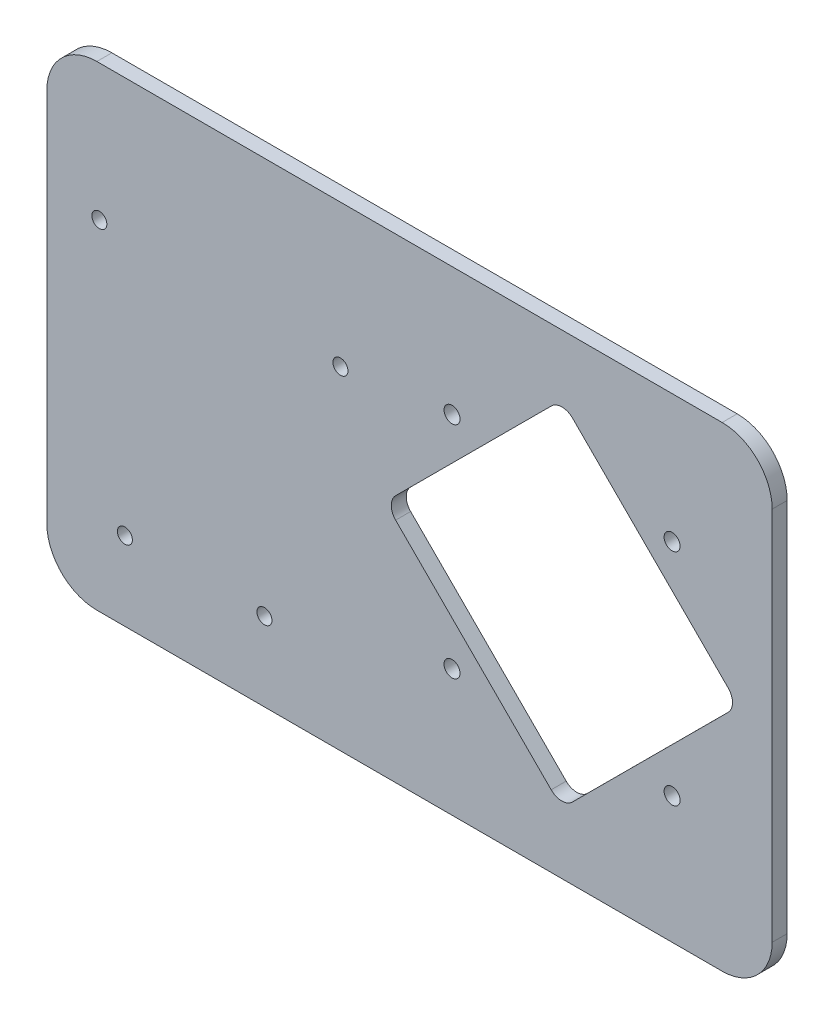
ISO-10303-21;
HEADER;
FILE_DESCRIPTION(('STEP AP214'),'2;1');
FILE_NAME('part.step','',(''),(''),'','','');
FILE_SCHEMA(('AUTOMOTIVE_DESIGN { 1 0 10303 214 1 1 1 1 }'));
ENDSEC;
DATA;
#1=APPLICATION_CONTEXT('core data for automotive mechanical design processes');
#2=APPLICATION_PROTOCOL_DEFINITION('international standard','automotive_design',2000,#1);
#3=PRODUCT_CONTEXT('',#1,'mechanical');
#4=PRODUCT('Part','Part','',(#3));
#5=PRODUCT_RELATED_PRODUCT_CATEGORY('part','',(#4));
#6=PRODUCT_DEFINITION_FORMATION('','',#4);
#7=PRODUCT_DEFINITION_CONTEXT('part definition',#1,'design');
#8=PRODUCT_DEFINITION('design','',#6,#7);
#9=PRODUCT_DEFINITION_SHAPE('','',#8);
#10=(LENGTH_UNIT() NAMED_UNIT(*) SI_UNIT(.MILLI.,.METRE.));
#11=(NAMED_UNIT(*) PLANE_ANGLE_UNIT() SI_UNIT($,.RADIAN.));
#12=(NAMED_UNIT(*) SI_UNIT($,.STERADIAN.) SOLID_ANGLE_UNIT());
#13=UNCERTAINTY_MEASURE_WITH_UNIT(LENGTH_MEASURE(1.E-05),#10,'distance_accuracy_value','');
#14=(GEOMETRIC_REPRESENTATION_CONTEXT(3) GLOBAL_UNCERTAINTY_ASSIGNED_CONTEXT((#13)) GLOBAL_UNIT_ASSIGNED_CONTEXT((#10,
#11,#12)) REPRESENTATION_CONTEXT('',''));
#15=CARTESIAN_POINT('',(0.,0.,0.));
#16=DIRECTION('',(0.,0.,1.));
#17=DIRECTION('',(1.,0.,0.));
#18=AXIS2_PLACEMENT_3D('',#15,#16,#17);
#19=CARTESIAN_POINT('',(269.068,12.31372,3.));
#20=DIRECTION('',(0.,0.,-1.));
#21=DIRECTION('',(-1.,0.,0.));
#22=AXIS2_PLACEMENT_3D('',#19,#20,#21);
#23=CYLINDRICAL_SURFACE('',#22,10.);
#24=CARTESIAN_POINT('',(269.068,12.31372,0.));
#25=DIRECTION('',(0.,0.,-1.));
#26=DIRECTION('',(-1.,0.,0.));
#27=AXIS2_PLACEMENT_3D('',#24,#25,#26);
#28=CIRCLE('',#27,10.);
#29=CARTESIAN_POINT('',(279.068,12.31372,0.));
#30=VERTEX_POINT('',#29);
#31=CARTESIAN_POINT('',(269.068,2.31372,0.));
#32=VERTEX_POINT('',#31);
#33=EDGE_CURVE('E278',#30,#32,#28,.T.);
#34=ORIENTED_EDGE('',*,*,#33,.F.);
#35=DIRECTION('',(0.,0.,-1.));
#36=VECTOR('',#35,1.);
#37=CARTESIAN_POINT('',(279.068,12.31372,3.));
#38=LINE('',#37,#36);
#39=CARTESIAN_POINT('',(279.068,12.31372,3.));
#40=VERTEX_POINT('',#39);
#41=EDGE_CURVE('E11',#40,#30,#38,.T.);
#42=ORIENTED_EDGE('',*,*,#41,.F.);
#43=CARTESIAN_POINT('',(269.068,12.31372,3.));
#44=DIRECTION('',(0.,0.,-1.));
#45=DIRECTION('',(-1.,0.,0.));
#46=AXIS2_PLACEMENT_3D('',#43,#44,#45);
#47=CIRCLE('',#46,10.);
#48=CARTESIAN_POINT('',(269.068,2.31372,3.));
#49=VERTEX_POINT('',#48);
#50=EDGE_CURVE('E282',#40,#49,#47,.T.);
#51=ORIENTED_EDGE('',*,*,#50,.T.);
#52=DIRECTION('',(0.,0.,-1.));
#53=VECTOR('',#52,1.);
#54=CARTESIAN_POINT('',(269.068,2.31372,3.));
#55=LINE('',#54,#53);
#56=EDGE_CURVE('E42',#49,#32,#55,.T.);
#57=ORIENTED_EDGE('',*,*,#56,.T.);
#58=EDGE_LOOP('',(#34,#42,#51,#57));
#59=FACE_BOUND('',#58,.T.);
#60=ADVANCED_FACE('F39',(#59),#23,.T.);
#61=CARTESIAN_POINT('',(279.068,87.313,3.));
#62=DIRECTION('',(1.,0.,0.));
#63=DIRECTION('',(0.,0.,-1.));
#64=AXIS2_PLACEMENT_3D('',#61,#62,#63);
#65=PLANE('',#64);
#66=DIRECTION('',(0.,-1.,0.));
#67=VECTOR('',#66,1.);
#68=CARTESIAN_POINT('',(279.068,87.313,0.));
#69=LINE('',#68,#67);
#70=CARTESIAN_POINT('',(279.068,87.313,0.));
#71=VERTEX_POINT('',#70);
#72=EDGE_CURVE('E287',#71,#30,#69,.T.);
#73=ORIENTED_EDGE('',*,*,#72,.F.);
#74=DIRECTION('',(0.,0.,-1.));
#75=VECTOR('',#74,1.);
#76=CARTESIAN_POINT('',(279.068,87.313,3.));
#77=LINE('',#76,#75);
#78=CARTESIAN_POINT('',(279.068,87.313,3.));
#79=VERTEX_POINT('',#78);
#80=EDGE_CURVE('E48',#79,#71,#77,.T.);
#81=ORIENTED_EDGE('',*,*,#80,.F.);
#82=DIRECTION('',(0.,-1.,0.));
#83=VECTOR('',#82,1.);
#84=CARTESIAN_POINT('',(279.068,87.313,3.));
#85=LINE('',#84,#83);
#86=EDGE_CURVE('E311',#79,#40,#85,.T.);
#87=ORIENTED_EDGE('',*,*,#86,.T.);
#88=ORIENTED_EDGE('',*,*,#41,.T.);
#89=EDGE_LOOP('',(#73,#81,#87,#88));
#90=FACE_BOUND('',#89,.T.);
#91=ADVANCED_FACE('F374',(#90),#65,.T.);
#92=CARTESIAN_POINT('',(269.068,87.313,3.));
#93=DIRECTION('',(0.,0.,-1.));
#94=DIRECTION('',(-1.,0.,0.));
#95=AXIS2_PLACEMENT_3D('',#92,#93,#94);
#96=CYLINDRICAL_SURFACE('',#95,10.);
#97=CARTESIAN_POINT('',(269.068,87.313,0.));
#98=DIRECTION('',(0.,0.,-1.));
#99=DIRECTION('',(-1.,0.,0.));
#100=AXIS2_PLACEMENT_3D('',#97,#98,#99);
#101=CIRCLE('',#100,10.);
#102=CARTESIAN_POINT('',(269.068,97.313,0.));
#103=VERTEX_POINT('',#102);
#104=EDGE_CURVE('E338',#103,#71,#101,.T.);
#105=ORIENTED_EDGE('',*,*,#104,.F.);
#106=DIRECTION('',(0.,0.,-1.));
#107=VECTOR('',#106,1.);
#108=CARTESIAN_POINT('',(269.068,97.313,3.));
#109=LINE('',#108,#107);
#110=CARTESIAN_POINT('',(269.068,97.313,3.));
#111=VERTEX_POINT('',#110);
#112=EDGE_CURVE('E347',#111,#103,#109,.T.);
#113=ORIENTED_EDGE('',*,*,#112,.F.);
#114=CARTESIAN_POINT('',(269.068,87.313,3.));
#115=DIRECTION('',(0.,0.,-1.));
#116=DIRECTION('',(-1.,0.,0.));
#117=AXIS2_PLACEMENT_3D('',#114,#115,#116);
#118=CIRCLE('',#117,10.);
#119=EDGE_CURVE('E307',#111,#79,#118,.T.);
#120=ORIENTED_EDGE('',*,*,#119,.T.);
#121=ORIENTED_EDGE('',*,*,#80,.T.);
#122=EDGE_LOOP('',(#105,#113,#120,#121));
#123=FACE_BOUND('',#122,.T.);
#124=ADVANCED_FACE('F394',(#123),#96,.T.);
#125=CARTESIAN_POINT('',(144.068,97.313,3.));
#126=DIRECTION('',(0.,1.,0.));
#127=DIRECTION('',(0.,0.,1.));
#128=AXIS2_PLACEMENT_3D('',#125,#126,#127);
#129=PLANE('',#128);
#130=DIRECTION('',(1.,0.,0.));
#131=VECTOR('',#130,1.);
#132=CARTESIAN_POINT('',(144.068,97.313,0.));
#133=LINE('',#132,#131);
#134=CARTESIAN_POINT('',(144.068,97.313,0.));
#135=VERTEX_POINT('',#134);
#136=EDGE_CURVE('E334',#135,#103,#133,.T.);
#137=ORIENTED_EDGE('',*,*,#136,.F.);
#138=DIRECTION('',(0.,0.,-1.));
#139=VECTOR('',#138,1.);
#140=CARTESIAN_POINT('',(144.068,97.313,3.));
#141=LINE('',#140,#139);
#142=CARTESIAN_POINT('',(144.068,97.313,3.));
#143=VERTEX_POINT('',#142);
#144=EDGE_CURVE('E350',#143,#135,#141,.T.);
#145=ORIENTED_EDGE('',*,*,#144,.F.);
#146=DIRECTION('',(1.,0.,0.));
#147=VECTOR('',#146,1.);
#148=CARTESIAN_POINT('',(144.068,97.313,3.));
#149=LINE('',#148,#147);
#150=EDGE_CURVE('E303',#143,#111,#149,.T.);
#151=ORIENTED_EDGE('',*,*,#150,.T.);
#152=ORIENTED_EDGE('',*,*,#112,.T.);
#153=EDGE_LOOP('',(#137,#145,#151,#152));
#154=FACE_BOUND('',#153,.T.);
#155=ADVANCED_FACE('F392',(#154),#129,.T.);
#156=CARTESIAN_POINT('',(144.068,87.313,3.));
#157=DIRECTION('',(0.,0.,-1.));
#158=DIRECTION('',(-1.,0.,0.));
#159=AXIS2_PLACEMENT_3D('',#156,#157,#158);
#160=CYLINDRICAL_SURFACE('',#159,9.99999999999995);
#161=CARTESIAN_POINT('',(144.068,87.313,0.));
#162=DIRECTION('',(0.,0.,-1.));
#163=DIRECTION('',(-1.,0.,0.));
#164=AXIS2_PLACEMENT_3D('',#161,#162,#163);
#165=CIRCLE('',#164,9.99999999999995);
#166=CARTESIAN_POINT('',(134.068,87.313,0.));
#167=VERTEX_POINT('',#166);
#168=EDGE_CURVE('E330',#167,#135,#165,.T.);
#169=ORIENTED_EDGE('',*,*,#168,.F.);
#170=DIRECTION('',(0.,0.,-1.));
#171=VECTOR('',#170,1.);
#172=CARTESIAN_POINT('',(134.068,87.313,3.));
#173=LINE('',#172,#171);
#174=CARTESIAN_POINT('',(134.068,87.313,3.));
#175=VERTEX_POINT('',#174);
#176=EDGE_CURVE('E353',#175,#167,#173,.T.);
#177=ORIENTED_EDGE('',*,*,#176,.F.);
#178=CARTESIAN_POINT('',(144.068,87.313,3.));
#179=DIRECTION('',(0.,0.,-1.));
#180=DIRECTION('',(-1.,0.,0.));
#181=AXIS2_PLACEMENT_3D('',#178,#179,#180);
#182=CIRCLE('',#181,9.99999999999995);
#183=EDGE_CURVE('E299',#175,#143,#182,.T.);
#184=ORIENTED_EDGE('',*,*,#183,.T.);
#185=ORIENTED_EDGE('',*,*,#144,.T.);
#186=EDGE_LOOP('',(#169,#177,#184,#185));
#187=FACE_BOUND('',#186,.T.);
#188=ADVANCED_FACE('F388',(#187),#160,.T.);
#189=CARTESIAN_POINT('',(134.068,12.31372,3.));
#190=DIRECTION('',(-1.,0.,0.));
#191=DIRECTION('',(0.,0.,1.));
#192=AXIS2_PLACEMENT_3D('',#189,#190,#191);
#193=PLANE('',#192);
#194=DIRECTION('',(0.,1.,0.));
#195=VECTOR('',#194,1.);
#196=CARTESIAN_POINT('',(134.068,12.31372,0.));
#197=LINE('',#196,#195);
#198=CARTESIAN_POINT('',(134.068,12.31372,0.));
#199=VERTEX_POINT('',#198);
#200=EDGE_CURVE('E326',#199,#167,#197,.T.);
#201=ORIENTED_EDGE('',*,*,#200,.F.);
#202=DIRECTION('',(0.,0.,-1.));
#203=VECTOR('',#202,1.);
#204=CARTESIAN_POINT('',(134.068,12.31372,3.));
#205=LINE('',#204,#203);
#206=CARTESIAN_POINT('',(134.068,12.31372,3.));
#207=VERTEX_POINT('',#206);
#208=EDGE_CURVE('E356',#207,#199,#205,.T.);
#209=ORIENTED_EDGE('',*,*,#208,.F.);
#210=DIRECTION('',(0.,1.,0.));
#211=VECTOR('',#210,1.);
#212=CARTESIAN_POINT('',(134.068,12.31372,3.));
#213=LINE('',#212,#211);
#214=EDGE_CURVE('E295',#207,#175,#213,.T.);
#215=ORIENTED_EDGE('',*,*,#214,.T.);
#216=ORIENTED_EDGE('',*,*,#176,.T.);
#217=EDGE_LOOP('',(#201,#209,#215,#216));
#218=FACE_BOUND('',#217,.T.);
#219=ADVANCED_FACE('F386',(#218),#193,.T.);
#220=CARTESIAN_POINT('',(144.068,12.31372,3.));
#221=DIRECTION('',(0.,0.,-1.));
#222=DIRECTION('',(-1.,0.,0.));
#223=AXIS2_PLACEMENT_3D('',#220,#221,#222);
#224=CYLINDRICAL_SURFACE('',#223,9.99999999999995);
#225=CARTESIAN_POINT('',(144.068,12.31372,0.));
#226=DIRECTION('',(0.,0.,-1.));
#227=DIRECTION('',(-1.,0.,0.));
#228=AXIS2_PLACEMENT_3D('',#225,#226,#227);
#229=CIRCLE('',#228,9.99999999999995);
#230=CARTESIAN_POINT('',(144.068,2.31372,0.));
#231=VERTEX_POINT('',#230);
#232=EDGE_CURVE('E322',#231,#199,#229,.T.);
#233=ORIENTED_EDGE('',*,*,#232,.F.);
#234=DIRECTION('',(0.,0.,-1.));
#235=VECTOR('',#234,1.);
#236=CARTESIAN_POINT('',(144.068,2.31372,3.));
#237=LINE('',#236,#235);
#238=CARTESIAN_POINT('',(144.068,2.31372,3.));
#239=VERTEX_POINT('',#238);
#240=EDGE_CURVE('E358',#239,#231,#237,.T.);
#241=ORIENTED_EDGE('',*,*,#240,.F.);
#242=CARTESIAN_POINT('',(144.068,12.31372,3.));
#243=DIRECTION('',(0.,0.,-1.));
#244=DIRECTION('',(-1.,0.,0.));
#245=AXIS2_PLACEMENT_3D('',#242,#243,#244);
#246=CIRCLE('',#245,9.99999999999995);
#247=EDGE_CURVE('E291',#239,#207,#246,.T.);
#248=ORIENTED_EDGE('',*,*,#247,.T.);
#249=ORIENTED_EDGE('',*,*,#208,.T.);
#250=EDGE_LOOP('',(#233,#241,#248,#249));
#251=FACE_BOUND('',#250,.T.);
#252=ADVANCED_FACE('F382',(#251),#224,.T.);
#253=CARTESIAN_POINT('',(269.068,2.31372,3.));
#254=DIRECTION('',(0.,-1.,0.));
#255=DIRECTION('',(0.,0.,-1.));
#256=AXIS2_PLACEMENT_3D('',#253,#254,#255);
#257=PLANE('',#256);
#258=DIRECTION('',(-1.,0.,0.));
#259=VECTOR('',#258,1.);
#260=CARTESIAN_POINT('',(269.068,2.31372,0.));
#261=LINE('',#260,#259);
#262=EDGE_CURVE('E318',#32,#231,#261,.T.);
#263=ORIENTED_EDGE('',*,*,#262,.F.);
#264=ORIENTED_EDGE('',*,*,#56,.F.);
#265=DIRECTION('',(-1.,0.,0.));
#266=VECTOR('',#265,1.);
#267=CARTESIAN_POINT('',(269.068,2.31372,3.));
#268=LINE('',#267,#266);
#269=EDGE_CURVE('E286',#49,#239,#268,.T.);
#270=ORIENTED_EDGE('',*,*,#269,.T.);
#271=ORIENTED_EDGE('',*,*,#240,.T.);
#272=EDGE_LOOP('',(#263,#264,#270,#271));
#273=FACE_BOUND('',#272,.T.);
#274=ADVANCED_FACE('F368',(#273),#257,.T.);
#275=CARTESIAN_POINT('',(269.068,12.31372,3.));
#276=DIRECTION('',(0.,0.,-1.));
#277=DIRECTION('',(-1.,0.,0.));
#278=AXIS2_PLACEMENT_3D('',#275,#276,#277);
#279=PLANE('',#278);
#280=CARTESIAN_POINT('',(259.067,27.688865329957,3.));
#281=DIRECTION('',(0.,0.,1.));
#282=DIRECTION('',(1.,0.,0.));
#283=AXIS2_PLACEMENT_3D('',#280,#281,#282);
#284=CIRCLE('',#283,1.59999999999996);
#285=CARTESIAN_POINT('',(260.667,27.688865329957,3.));
#286=VERTEX_POINT('',#285);
#287=EDGE_CURVE('E634',#286,#286,#284,.T.);
#288=ORIENTED_EDGE('',*,*,#287,.F.);
#289=EDGE_LOOP('',(#288));
#290=FACE_BOUND('',#289,.T.);
#291=CARTESIAN_POINT('',(215.068,27.688865329957,3.));
#292=DIRECTION('',(0.,0.,1.));
#293=DIRECTION('',(1.,0.,0.));
#294=AXIS2_PLACEMENT_3D('',#291,#292,#293);
#295=CIRCLE('',#294,1.59999999999999);
#296=CARTESIAN_POINT('',(216.668,27.688865329957,3.));
#297=VERTEX_POINT('',#296);
#298=EDGE_CURVE('E638',#297,#297,#295,.T.);
#299=ORIENTED_EDGE('',*,*,#298,.F.);
#300=EDGE_LOOP('',(#299));
#301=FACE_BOUND('',#300,.T.);
#302=CARTESIAN_POINT('',(215.068,71.689665329957,3.));
#303=DIRECTION('',(0.,0.,1.));
#304=DIRECTION('',(1.,0.,0.));
#305=AXIS2_PLACEMENT_3D('',#302,#303,#304);
#306=CIRCLE('',#305,1.59999999999999);
#307=CARTESIAN_POINT('',(216.668,71.689665329957,3.));
#308=VERTEX_POINT('',#307);
#309=EDGE_CURVE('E652',#308,#308,#306,.T.);
#310=ORIENTED_EDGE('',*,*,#309,.F.);
#311=EDGE_LOOP('',(#310));
#312=FACE_BOUND('',#311,.T.);
#313=CARTESIAN_POINT('',(259.067,71.689665329957,3.));
#314=DIRECTION('',(0.,0.,1.));
#315=DIRECTION('',(1.,0.,0.));
#316=AXIS2_PLACEMENT_3D('',#313,#314,#315);
#317=CIRCLE('',#316,1.59999999999997);
#318=CARTESIAN_POINT('',(260.667,71.689665329957,3.));
#319=VERTEX_POINT('',#318);
#320=EDGE_CURVE('E182',#319,#319,#317,.T.);
#321=ORIENTED_EDGE('',*,*,#320,.F.);
#322=EDGE_LOOP('',(#321));
#323=FACE_BOUND('',#322,.T.);
#324=DIRECTION('',(0.706685062660333,-0.707528248349676,0.));
#325=VECTOR('',#324,1.);
#326=CARTESIAN_POINT('',(270.266244410533,51.9692418048033,3.));
#327=LINE('',#326,#325);
#328=CARTESIAN_POINT('',(239.172302587203,83.1002835587188,3.));
#329=VERTEX_POINT('',#328);
#330=CARTESIAN_POINT('',(270.266244410533,51.9692418048033,3.));
#331=VERTEX_POINT('',#330);
#332=EDGE_CURVE('E162',#329,#331,#327,.T.);
#333=ORIENTED_EDGE('',*,*,#332,.T.);
#334=CARTESIAN_POINT('',(268.143659665484,49.8491866168224,3.));
#335=DIRECTION('',(0.,0.,-1.));
#336=DIRECTION('',(1.,0.,0.));
#337=AXIS2_PLACEMENT_3D('',#334,#335,#336);
#338=CIRCLE('',#337,2.99999999999997);
#339=CARTESIAN_POINT('',(270.263714853465,47.7266018717733,3.));
#340=VERTEX_POINT('',#339);
#341=EDGE_CURVE('E155',#331,#340,#338,.T.);
#342=ORIENTED_EDGE('',*,*,#341,.T.);
#343=DIRECTION('',(-0.707528248349686,-0.706685062660324,0.));
#344=VECTOR('',#343,1.);
#345=CARTESIAN_POINT('',(239.132411097355,16.6323983584871,3.));
#346=LINE('',#345,#344);
#347=CARTESIAN_POINT('',(239.132411097355,16.6323983584871,3.));
#348=VERTEX_POINT('',#347);
#349=EDGE_CURVE('E165',#340,#348,#346,.T.);
#350=ORIENTED_EDGE('',*,*,#349,.T.);
#351=CARTESIAN_POINT('',(237.012355909374,18.7549831035361,3.));
#352=DIRECTION('',(0.,0.,-1.));
#353=DIRECTION('',(1.,0.,0.));
#354=AXIS2_PLACEMENT_3D('',#351,#352,#353);
#355=CIRCLE('',#354,3.00000000000002);
#356=CARTESIAN_POINT('',(234.889771164325,16.6349279155551,3.));
#357=VERTEX_POINT('',#356);
#358=EDGE_CURVE('E56',#348,#357,#355,.T.);
#359=ORIENTED_EDGE('',*,*,#358,.T.);
#360=DIRECTION('',(-0.706685062660328,0.707528248349681,0.));
#361=VECTOR('',#360,1.);
#362=CARTESIAN_POINT('',(203.795829340996,47.7659696694706,3.));
#363=LINE('',#362,#361);
#364=CARTESIAN_POINT('',(203.795829340996,47.7659696694706,3.));
#365=VERTEX_POINT('',#364);
#366=EDGE_CURVE('E187',#357,#365,#363,.T.);
#367=ORIENTED_EDGE('',*,*,#366,.T.);
#368=CARTESIAN_POINT('',(205.918414086045,49.8860248574516,3.));
#369=DIRECTION('',(0.,0.,-1.));
#370=DIRECTION('',(1.,0.,0.));
#371=AXIS2_PLACEMENT_3D('',#368,#369,#370);
#372=CIRCLE('',#371,3.00000000000002);
#373=CARTESIAN_POINT('',(203.798358898064,52.0086096025007,3.));
#374=VERTEX_POINT('',#373);
#375=EDGE_CURVE('E191',#365,#374,#372,.T.);
#376=ORIENTED_EDGE('',*,*,#375,.T.);
#377=DIRECTION('',(0.707528248349681,0.706685062660328,0.));
#378=VECTOR('',#377,1.);
#379=CARTESIAN_POINT('',(234.929662654173,83.1028131157869,3.));
#380=LINE('',#379,#378);
#381=CARTESIAN_POINT('',(234.929662654173,83.1028131157869,3.));
#382=VERTEX_POINT('',#381);
#383=EDGE_CURVE('E195',#374,#382,#380,.T.);
#384=ORIENTED_EDGE('',*,*,#383,.T.);
#385=CARTESIAN_POINT('',(237.049717842154,80.9802283707379,3.));
#386=DIRECTION('',(0.,0.,-1.));
#387=DIRECTION('',(1.,0.,0.));
#388=AXIS2_PLACEMENT_3D('',#385,#386,#387);
#389=CIRCLE('',#388,2.99999999999998);
#390=EDGE_CURVE('E199',#382,#329,#389,.T.);
#391=ORIENTED_EDGE('',*,*,#390,.T.);
#392=EDGE_LOOP('',(#333,#342,#350,#359,#367,#376,#384,#391));
#393=FACE_BOUND('',#392,.T.);
#394=CARTESIAN_POINT('',(177.568,18.028765329957,3.));
#395=DIRECTION('',(0.,0.,-1.));
#396=DIRECTION('',(1.,0.,0.));
#397=AXIS2_PLACEMENT_3D('',#394,#395,#396);
#398=CIRCLE('',#397,1.5);
#399=CARTESIAN_POINT('',(179.068,18.028765329957,3.));
#400=VERTEX_POINT('',#399);
#401=EDGE_CURVE('E250',#400,#400,#398,.T.);
#402=ORIENTED_EDGE('',*,*,#401,.T.);
#403=EDGE_LOOP('',(#402));
#404=FACE_BOUND('',#403,.T.);
#405=CARTESIAN_POINT('',(149.668,18.028765329957,3.));
#406=DIRECTION('',(0.,0.,-1.));
#407=DIRECTION('',(1.,0.,0.));
#408=AXIS2_PLACEMENT_3D('',#405,#406,#407);
#409=CIRCLE('',#408,1.5);
#410=CARTESIAN_POINT('',(151.168,18.028765329957,3.));
#411=VERTEX_POINT('',#410);
#412=EDGE_CURVE('E258',#411,#411,#409,.T.);
#413=ORIENTED_EDGE('',*,*,#412,.T.);
#414=EDGE_LOOP('',(#413));
#415=FACE_BOUND('',#414,.T.);
#416=CARTESIAN_POINT('',(192.767,68.828965329957,3.));
#417=DIRECTION('',(0.,0.,-1.));
#418=DIRECTION('',(1.,0.,0.));
#419=AXIS2_PLACEMENT_3D('',#416,#417,#418);
#420=CIRCLE('',#419,1.5);
#421=CARTESIAN_POINT('',(194.267,68.828965329957,3.));
#422=VERTEX_POINT('',#421);
#423=EDGE_CURVE('E266',#422,#422,#420,.T.);
#424=ORIENTED_EDGE('',*,*,#423,.T.);
#425=EDGE_LOOP('',(#424));
#426=FACE_BOUND('',#425,.T.);
#427=CARTESIAN_POINT('',(144.568,70.128265329957,3.));
#428=DIRECTION('',(0.,0.,-1.));
#429=DIRECTION('',(1.,0.,0.));
#430=AXIS2_PLACEMENT_3D('',#427,#428,#429);
#431=CIRCLE('',#430,1.5);
#432=CARTESIAN_POINT('',(146.068,70.128265329957,3.));
#433=VERTEX_POINT('',#432);
#434=EDGE_CURVE('E274',#433,#433,#431,.T.);
#435=ORIENTED_EDGE('',*,*,#434,.T.);
#436=EDGE_LOOP('',(#435));
#437=FACE_BOUND('',#436,.T.);
#438=ORIENTED_EDGE('',*,*,#50,.F.);
#439=ORIENTED_EDGE('',*,*,#86,.F.);
#440=ORIENTED_EDGE('',*,*,#119,.F.);
#441=ORIENTED_EDGE('',*,*,#150,.F.);
#442=ORIENTED_EDGE('',*,*,#183,.F.);
#443=ORIENTED_EDGE('',*,*,#214,.F.);
#444=ORIENTED_EDGE('',*,*,#247,.F.);
#445=ORIENTED_EDGE('',*,*,#269,.F.);
#446=EDGE_LOOP('',(#438,#439,#440,#441,#442,#443,#444,#445));
#447=FACE_BOUND('',#446,.T.);
#448=ADVANCED_FACE('F170',(#290,#301,#312,#323,#393,#404,#415,#426,#437,#447),#279,.F.);
#449=CARTESIAN_POINT('',(269.068,12.31372,0.));
#450=DIRECTION('',(0.,0.,-1.));
#451=DIRECTION('',(-1.,0.,0.));
#452=AXIS2_PLACEMENT_3D('',#449,#450,#451);
#453=PLANE('',#452);
#454=CARTESIAN_POINT('',(259.067,27.688865329957,0.));
#455=DIRECTION('',(0.,0.,1.));
#456=DIRECTION('',(1.,0.,0.));
#457=AXIS2_PLACEMENT_3D('',#454,#455,#456);
#458=CIRCLE('',#457,1.59999999999996);
#459=CARTESIAN_POINT('',(260.667,27.688865329957,0.));
#460=VERTEX_POINT('',#459);
#461=EDGE_CURVE('E631',#460,#460,#458,.T.);
#462=ORIENTED_EDGE('',*,*,#461,.T.);
#463=EDGE_LOOP('',(#462));
#464=FACE_BOUND('',#463,.T.);
#465=CARTESIAN_POINT('',(215.068,27.688865329957,0.));
#466=DIRECTION('',(0.,0.,1.));
#467=DIRECTION('',(1.,0.,0.));
#468=AXIS2_PLACEMENT_3D('',#465,#466,#467);
#469=CIRCLE('',#468,1.59999999999999);
#470=CARTESIAN_POINT('',(216.668,27.688865329957,0.));
#471=VERTEX_POINT('',#470);
#472=EDGE_CURVE('E658',#471,#471,#469,.T.);
#473=ORIENTED_EDGE('',*,*,#472,.T.);
#474=EDGE_LOOP('',(#473));
#475=FACE_BOUND('',#474,.T.);
#476=CARTESIAN_POINT('',(215.068,71.689665329957,0.));
#477=DIRECTION('',(0.,0.,1.));
#478=DIRECTION('',(1.,0.,0.));
#479=AXIS2_PLACEMENT_3D('',#476,#477,#478);
#480=CIRCLE('',#479,1.59999999999999);
#481=CARTESIAN_POINT('',(216.668,71.689665329957,0.));
#482=VERTEX_POINT('',#481);
#483=EDGE_CURVE('E647',#482,#482,#480,.T.);
#484=ORIENTED_EDGE('',*,*,#483,.T.);
#485=EDGE_LOOP('',(#484));
#486=FACE_BOUND('',#485,.T.);
#487=CARTESIAN_POINT('',(259.067,71.689665329957,0.));
#488=DIRECTION('',(0.,0.,1.));
#489=DIRECTION('',(1.,0.,0.));
#490=AXIS2_PLACEMENT_3D('',#487,#488,#489);
#491=CIRCLE('',#490,1.59999999999997);
#492=CARTESIAN_POINT('',(260.667,71.689665329957,0.));
#493=VERTEX_POINT('',#492);
#494=EDGE_CURVE('E207',#493,#493,#491,.T.);
#495=ORIENTED_EDGE('',*,*,#494,.T.);
#496=EDGE_LOOP('',(#495));
#497=FACE_BOUND('',#496,.T.);
#498=CARTESIAN_POINT('',(268.143659665484,49.8491866168224,0.));
#499=DIRECTION('',(0.,0.,-1.));
#500=DIRECTION('',(1.,0.,0.));
#501=AXIS2_PLACEMENT_3D('',#498,#499,#500);
#502=CIRCLE('',#501,2.99999999999997);
#503=CARTESIAN_POINT('',(270.266244410533,51.9692418048033,0.));
#504=VERTEX_POINT('',#503);
#505=CARTESIAN_POINT('',(270.263714853465,47.7266018717733,0.));
#506=VERTEX_POINT('',#505);
#507=EDGE_CURVE('E64',#504,#506,#502,.T.);
#508=ORIENTED_EDGE('',*,*,#507,.F.);
#509=DIRECTION('',(0.706685062660333,-0.707528248349676,0.));
#510=VECTOR('',#509,1.);
#511=CARTESIAN_POINT('',(270.266244410533,51.9692418048033,0.));
#512=LINE('',#511,#510);
#513=CARTESIAN_POINT('',(239.172302587203,83.1002835587188,0.));
#514=VERTEX_POINT('',#513);
#515=EDGE_CURVE('E175',#514,#504,#512,.T.);
#516=ORIENTED_EDGE('',*,*,#515,.F.);
#517=CARTESIAN_POINT('',(237.049717842154,80.9802283707379,0.));
#518=DIRECTION('',(0.,0.,-1.));
#519=DIRECTION('',(1.,0.,0.));
#520=AXIS2_PLACEMENT_3D('',#517,#518,#519);
#521=CIRCLE('',#520,2.99999999999998);
#522=CARTESIAN_POINT('',(234.929662654173,83.1028131157869,0.));
#523=VERTEX_POINT('',#522);
#524=EDGE_CURVE('E179',#523,#514,#521,.T.);
#525=ORIENTED_EDGE('',*,*,#524,.F.);
#526=DIRECTION('',(0.707528248349681,0.706685062660328,0.));
#527=VECTOR('',#526,1.);
#528=CARTESIAN_POINT('',(234.929662654173,83.1028131157869,0.));
#529=LINE('',#528,#527);
#530=CARTESIAN_POINT('',(203.798358898064,52.0086096025007,0.));
#531=VERTEX_POINT('',#530);
#532=EDGE_CURVE('E222',#531,#523,#529,.T.);
#533=ORIENTED_EDGE('',*,*,#532,.F.);
#534=CARTESIAN_POINT('',(205.918414086045,49.8860248574516,0.));
#535=DIRECTION('',(0.,0.,-1.));
#536=DIRECTION('',(1.,0.,0.));
#537=AXIS2_PLACEMENT_3D('',#534,#535,#536);
#538=CIRCLE('',#537,3.00000000000002);
#539=CARTESIAN_POINT('',(203.795829340996,47.7659696694706,0.));
#540=VERTEX_POINT('',#539);
#541=EDGE_CURVE('E218',#540,#531,#538,.T.);
#542=ORIENTED_EDGE('',*,*,#541,.F.);
#543=DIRECTION('',(-0.706685062660328,0.707528248349681,0.));
#544=VECTOR('',#543,1.);
#545=CARTESIAN_POINT('',(203.795829340996,47.7659696694706,0.));
#546=LINE('',#545,#544);
#547=CARTESIAN_POINT('',(234.889771164325,16.6349279155551,0.));
#548=VERTEX_POINT('',#547);
#549=EDGE_CURVE('E214',#548,#540,#546,.T.);
#550=ORIENTED_EDGE('',*,*,#549,.F.);
#551=CARTESIAN_POINT('',(237.012355909374,18.7549831035361,0.));
#552=DIRECTION('',(0.,0.,-1.));
#553=DIRECTION('',(1.,0.,0.));
#554=AXIS2_PLACEMENT_3D('',#551,#552,#553);
#555=CIRCLE('',#554,3.00000000000002);
#556=CARTESIAN_POINT('',(239.132411097355,16.6323983584871,0.));
#557=VERTEX_POINT('',#556);
#558=EDGE_CURVE('E210',#557,#548,#555,.T.);
#559=ORIENTED_EDGE('',*,*,#558,.F.);
#560=DIRECTION('',(-0.707528248349686,-0.706685062660324,0.));
#561=VECTOR('',#560,1.);
#562=CARTESIAN_POINT('',(239.132411097355,16.6323983584871,0.));
#563=LINE('',#562,#561);
#564=EDGE_CURVE('E206',#506,#557,#563,.T.);
#565=ORIENTED_EDGE('',*,*,#564,.F.);
#566=EDGE_LOOP('',(#508,#516,#525,#533,#542,#550,#559,#565));
#567=FACE_BOUND('',#566,.T.);
#568=CARTESIAN_POINT('',(177.568,18.028765329957,0.));
#569=DIRECTION('',(0.,0.,-1.));
#570=DIRECTION('',(1.,0.,0.));
#571=AXIS2_PLACEMENT_3D('',#568,#569,#570);
#572=CIRCLE('',#571,1.5);
#573=CARTESIAN_POINT('',(179.068,18.028765329957,0.));
#574=VERTEX_POINT('',#573);
#575=EDGE_CURVE('E232',#574,#574,#572,.T.);
#576=ORIENTED_EDGE('',*,*,#575,.F.);
#577=EDGE_LOOP('',(#576));
#578=FACE_BOUND('',#577,.T.);
#579=CARTESIAN_POINT('',(149.668,18.028765329957,0.));
#580=DIRECTION('',(0.,0.,-1.));
#581=DIRECTION('',(1.,0.,0.));
#582=AXIS2_PLACEMENT_3D('',#579,#580,#581);
#583=CIRCLE('',#582,1.5);
#584=CARTESIAN_POINT('',(151.168,18.028765329957,0.));
#585=VERTEX_POINT('',#584);
#586=EDGE_CURVE('E254',#585,#585,#583,.T.);
#587=ORIENTED_EDGE('',*,*,#586,.F.);
#588=EDGE_LOOP('',(#587));
#589=FACE_BOUND('',#588,.T.);
#590=CARTESIAN_POINT('',(192.767,68.828965329957,0.));
#591=DIRECTION('',(0.,0.,-1.));
#592=DIRECTION('',(1.,0.,0.));
#593=AXIS2_PLACEMENT_3D('',#590,#591,#592);
#594=CIRCLE('',#593,1.5);
#595=CARTESIAN_POINT('',(194.267,68.828965329957,0.));
#596=VERTEX_POINT('',#595);
#597=EDGE_CURVE('E262',#596,#596,#594,.T.);
#598=ORIENTED_EDGE('',*,*,#597,.F.);
#599=EDGE_LOOP('',(#598));
#600=FACE_BOUND('',#599,.T.);
#601=CARTESIAN_POINT('',(144.568,70.128265329957,0.));
#602=DIRECTION('',(0.,0.,-1.));
#603=DIRECTION('',(1.,0.,0.));
#604=AXIS2_PLACEMENT_3D('',#601,#602,#603);
#605=CIRCLE('',#604,1.5);
#606=CARTESIAN_POINT('',(146.068,70.128265329957,0.));
#607=VERTEX_POINT('',#606);
#608=EDGE_CURVE('E270',#607,#607,#605,.T.);
#609=ORIENTED_EDGE('',*,*,#608,.F.);
#610=EDGE_LOOP('',(#609));
#611=FACE_BOUND('',#610,.T.);
#612=ORIENTED_EDGE('',*,*,#33,.T.);
#613=ORIENTED_EDGE('',*,*,#262,.T.);
#614=ORIENTED_EDGE('',*,*,#232,.T.);
#615=ORIENTED_EDGE('',*,*,#200,.T.);
#616=ORIENTED_EDGE('',*,*,#168,.T.);
#617=ORIENTED_EDGE('',*,*,#136,.T.);
#618=ORIENTED_EDGE('',*,*,#104,.T.);
#619=ORIENTED_EDGE('',*,*,#72,.T.);
#620=EDGE_LOOP('',(#612,#613,#614,#615,#616,#617,#618,#619));
#621=FACE_BOUND('',#620,.T.);
#622=ADVANCED_FACE('F370',(#464,#475,#486,#497,#567,#578,#589,#600,#611,#621),#453,.T.);
#623=CARTESIAN_POINT('',(144.568,70.128265329957,3.));
#624=DIRECTION('',(0.,0.,-1.));
#625=DIRECTION('',(-1.,0.,0.));
#626=AXIS2_PLACEMENT_3D('',#623,#624,#625);
#627=CYLINDRICAL_SURFACE('',#626,1.5);
#628=ORIENTED_EDGE('',*,*,#434,.F.);
#629=EDGE_LOOP('',(#628));
#630=FACE_BOUND('',#629,.T.);
#631=ORIENTED_EDGE('',*,*,#608,.T.);
#632=EDGE_LOOP('',(#631));
#633=FACE_BOUND('',#632,.T.);
#634=ADVANCED_FACE('F458',(#630,#633),#627,.F.);
#635=CARTESIAN_POINT('',(192.767,68.828965329957,3.));
#636=DIRECTION('',(0.,0.,-1.));
#637=DIRECTION('',(-1.,0.,0.));
#638=AXIS2_PLACEMENT_3D('',#635,#636,#637);
#639=CYLINDRICAL_SURFACE('',#638,1.5);
#640=ORIENTED_EDGE('',*,*,#423,.F.);
#641=EDGE_LOOP('',(#640));
#642=FACE_BOUND('',#641,.T.);
#643=ORIENTED_EDGE('',*,*,#597,.T.);
#644=EDGE_LOOP('',(#643));
#645=FACE_BOUND('',#644,.T.);
#646=ADVANCED_FACE('F463',(#642,#645),#639,.F.);
#647=CARTESIAN_POINT('',(149.668,18.028765329957,3.));
#648=DIRECTION('',(0.,0.,-1.));
#649=DIRECTION('',(-1.,0.,0.));
#650=AXIS2_PLACEMENT_3D('',#647,#648,#649);
#651=CYLINDRICAL_SURFACE('',#650,1.5);
#652=ORIENTED_EDGE('',*,*,#412,.F.);
#653=EDGE_LOOP('',(#652));
#654=FACE_BOUND('',#653,.T.);
#655=ORIENTED_EDGE('',*,*,#586,.T.);
#656=EDGE_LOOP('',(#655));
#657=FACE_BOUND('',#656,.T.);
#658=ADVANCED_FACE('F475',(#654,#657),#651,.F.);
#659=CARTESIAN_POINT('',(177.568,18.028765329957,3.));
#660=DIRECTION('',(0.,0.,-1.));
#661=DIRECTION('',(-1.,0.,0.));
#662=AXIS2_PLACEMENT_3D('',#659,#660,#661);
#663=CYLINDRICAL_SURFACE('',#662,1.5);
#664=ORIENTED_EDGE('',*,*,#401,.F.);
#665=EDGE_LOOP('',(#664));
#666=FACE_BOUND('',#665,.T.);
#667=ORIENTED_EDGE('',*,*,#575,.T.);
#668=EDGE_LOOP('',(#667));
#669=FACE_BOUND('',#668,.T.);
#670=ADVANCED_FACE('F485',(#666,#669),#663,.F.);
#671=CARTESIAN_POINT('',(268.143659665484,49.8491866168224,3.));
#672=DIRECTION('',(0.,0.,-1.));
#673=DIRECTION('',(-1.,0.,0.));
#674=AXIS2_PLACEMENT_3D('',#671,#672,#673);
#675=CYLINDRICAL_SURFACE('',#674,2.99999999999997);
#676=ORIENTED_EDGE('',*,*,#507,.T.);
#677=DIRECTION('',(0.,0.,-1.));
#678=VECTOR('',#677,1.);
#679=CARTESIAN_POINT('',(270.263714853465,47.7266018717733,3.));
#680=LINE('',#679,#678);
#681=EDGE_CURVE('E151',#340,#506,#680,.T.);
#682=ORIENTED_EDGE('',*,*,#681,.F.);
#683=ORIENTED_EDGE('',*,*,#341,.F.);
#684=DIRECTION('',(0.,0.,-1.));
#685=VECTOR('',#684,1.);
#686=CARTESIAN_POINT('',(270.266244410533,51.9692418048033,3.));
#687=LINE('',#686,#685);
#688=EDGE_CURVE('E229',#331,#504,#687,.T.);
#689=ORIENTED_EDGE('',*,*,#688,.T.);
#690=EDGE_LOOP('',(#676,#682,#683,#689));
#691=FACE_BOUND('',#690,.T.);
#692=ADVANCED_FACE('F153',(#691),#675,.F.);
#693=CARTESIAN_POINT('',(270.266244410533,51.9692418048033,3.));
#694=DIRECTION('',(0.707528248349676,0.706685062660333,0.));
#695=DIRECTION('',(-0.706685062660333,0.707528248349676,0.));
#696=AXIS2_PLACEMENT_3D('',#693,#694,#695);
#697=PLANE('',#696);
#698=ORIENTED_EDGE('',*,*,#515,.T.);
#699=ORIENTED_EDGE('',*,*,#688,.F.);
#700=ORIENTED_EDGE('',*,*,#332,.F.);
#701=DIRECTION('',(0.,0.,-1.));
#702=VECTOR('',#701,1.);
#703=CARTESIAN_POINT('',(239.172302587203,83.1002835587188,3.));
#704=LINE('',#703,#702);
#705=EDGE_CURVE('E233',#329,#514,#704,.T.);
#706=ORIENTED_EDGE('',*,*,#705,.T.);
#707=EDGE_LOOP('',(#698,#699,#700,#706));
#708=FACE_BOUND('',#707,.T.);
#709=ADVANCED_FACE('F504',(#708),#697,.F.);
#710=CARTESIAN_POINT('',(237.049717842154,80.9802283707379,3.));
#711=DIRECTION('',(0.,0.,-1.));
#712=DIRECTION('',(-1.,0.,0.));
#713=AXIS2_PLACEMENT_3D('',#710,#711,#712);
#714=CYLINDRICAL_SURFACE('',#713,2.99999999999998);
#715=ORIENTED_EDGE('',*,*,#524,.T.);
#716=ORIENTED_EDGE('',*,*,#705,.F.);
#717=ORIENTED_EDGE('',*,*,#390,.F.);
#718=DIRECTION('',(0.,0.,-1.));
#719=VECTOR('',#718,1.);
#720=CARTESIAN_POINT('',(234.929662654173,83.1028131157869,3.));
#721=LINE('',#720,#719);
#722=EDGE_CURVE('E236',#382,#523,#721,.T.);
#723=ORIENTED_EDGE('',*,*,#722,.T.);
#724=EDGE_LOOP('',(#715,#716,#717,#723));
#725=FACE_BOUND('',#724,.T.);
#726=ADVANCED_FACE('F513',(#725),#714,.F.);
#727=CARTESIAN_POINT('',(234.929662654173,83.1028131157869,3.));
#728=DIRECTION('',(-0.706685062660328,0.707528248349681,0.));
#729=DIRECTION('',(-0.707528248349681,-0.706685062660328,0.));
#730=AXIS2_PLACEMENT_3D('',#727,#728,#729);
#731=PLANE('',#730);
#732=ORIENTED_EDGE('',*,*,#532,.T.);
#733=ORIENTED_EDGE('',*,*,#722,.F.);
#734=ORIENTED_EDGE('',*,*,#383,.F.);
#735=DIRECTION('',(0.,0.,-1.));
#736=VECTOR('',#735,1.);
#737=CARTESIAN_POINT('',(203.798358898064,52.0086096025007,3.));
#738=LINE('',#737,#736);
#739=EDGE_CURVE('E239',#374,#531,#738,.T.);
#740=ORIENTED_EDGE('',*,*,#739,.T.);
#741=EDGE_LOOP('',(#732,#733,#734,#740));
#742=FACE_BOUND('',#741,.T.);
#743=ADVANCED_FACE('F523',(#742),#731,.F.);
#744=CARTESIAN_POINT('',(205.918414086045,49.8860248574516,3.));
#745=DIRECTION('',(0.,0.,-1.));
#746=DIRECTION('',(-1.,0.,0.));
#747=AXIS2_PLACEMENT_3D('',#744,#745,#746);
#748=CYLINDRICAL_SURFACE('',#747,3.00000000000002);
#749=ORIENTED_EDGE('',*,*,#541,.T.);
#750=ORIENTED_EDGE('',*,*,#739,.F.);
#751=ORIENTED_EDGE('',*,*,#375,.F.);
#752=DIRECTION('',(0.,0.,-1.));
#753=VECTOR('',#752,1.);
#754=CARTESIAN_POINT('',(203.795829340996,47.7659696694706,3.));
#755=LINE('',#754,#753);
#756=EDGE_CURVE('E242',#365,#540,#755,.T.);
#757=ORIENTED_EDGE('',*,*,#756,.T.);
#758=EDGE_LOOP('',(#749,#750,#751,#757));
#759=FACE_BOUND('',#758,.T.);
#760=ADVANCED_FACE('F533',(#759),#748,.F.);
#761=CARTESIAN_POINT('',(203.795829340996,47.7659696694706,3.));
#762=DIRECTION('',(-0.707528248349681,-0.706685062660328,0.));
#763=DIRECTION('',(0.706685062660328,-0.707528248349681,0.));
#764=AXIS2_PLACEMENT_3D('',#761,#762,#763);
#765=PLANE('',#764);
#766=ORIENTED_EDGE('',*,*,#549,.T.);
#767=ORIENTED_EDGE('',*,*,#756,.F.);
#768=ORIENTED_EDGE('',*,*,#366,.F.);
#769=DIRECTION('',(0.,0.,-1.));
#770=VECTOR('',#769,1.);
#771=CARTESIAN_POINT('',(234.889771164325,16.6349279155551,3.));
#772=LINE('',#771,#770);
#773=EDGE_CURVE('E245',#357,#548,#772,.T.);
#774=ORIENTED_EDGE('',*,*,#773,.T.);
#775=EDGE_LOOP('',(#766,#767,#768,#774));
#776=FACE_BOUND('',#775,.T.);
#777=ADVANCED_FACE('F543',(#776),#765,.F.);
#778=CARTESIAN_POINT('',(237.012355909374,18.7549831035361,3.));
#779=DIRECTION('',(0.,0.,-1.));
#780=DIRECTION('',(-1.,0.,0.));
#781=AXIS2_PLACEMENT_3D('',#778,#779,#780);
#782=CYLINDRICAL_SURFACE('',#781,3.00000000000002);
#783=ORIENTED_EDGE('',*,*,#558,.T.);
#784=ORIENTED_EDGE('',*,*,#773,.F.);
#785=ORIENTED_EDGE('',*,*,#358,.F.);
#786=DIRECTION('',(0.,0.,-1.));
#787=VECTOR('',#786,1.);
#788=CARTESIAN_POINT('',(239.132411097355,16.6323983584871,3.));
#789=LINE('',#788,#787);
#790=EDGE_CURVE('E161',#348,#557,#789,.T.);
#791=ORIENTED_EDGE('',*,*,#790,.T.);
#792=EDGE_LOOP('',(#783,#784,#785,#791));
#793=FACE_BOUND('',#792,.T.);
#794=ADVANCED_FACE('F553',(#793),#782,.F.);
#795=CARTESIAN_POINT('',(239.132411097355,16.6323983584871,3.));
#796=DIRECTION('',(0.706685062660323,-0.707528248349686,0.));
#797=DIRECTION('',(0.707528248349686,0.706685062660323,0.));
#798=AXIS2_PLACEMENT_3D('',#795,#796,#797);
#799=PLANE('',#798);
#800=ORIENTED_EDGE('',*,*,#564,.T.);
#801=ORIENTED_EDGE('',*,*,#790,.F.);
#802=ORIENTED_EDGE('',*,*,#349,.F.);
#803=ORIENTED_EDGE('',*,*,#681,.T.);
#804=EDGE_LOOP('',(#800,#801,#802,#803));
#805=FACE_BOUND('',#804,.T.);
#806=ADVANCED_FACE('F166',(#805),#799,.F.);
#807=CARTESIAN_POINT('',(259.067,71.689665329957,0.));
#808=DIRECTION('',(0.,0.,1.));
#809=DIRECTION('',(1.,0.,0.));
#810=AXIS2_PLACEMENT_3D('',#807,#808,#809);
#811=CYLINDRICAL_SURFACE('',#810,1.59999999999997);
#812=ORIENTED_EDGE('',*,*,#494,.F.);
#813=EDGE_LOOP('',(#812));
#814=FACE_BOUND('',#813,.T.);
#815=ORIENTED_EDGE('',*,*,#320,.T.);
#816=EDGE_LOOP('',(#815));
#817=FACE_BOUND('',#816,.T.);
#818=ADVANCED_FACE('F571',(#814,#817),#811,.F.);
#819=CARTESIAN_POINT('',(215.068,71.689665329957,0.));
#820=DIRECTION('',(0.,0.,1.));
#821=DIRECTION('',(1.,0.,0.));
#822=AXIS2_PLACEMENT_3D('',#819,#820,#821);
#823=CYLINDRICAL_SURFACE('',#822,1.59999999999999);
#824=ORIENTED_EDGE('',*,*,#483,.F.);
#825=EDGE_LOOP('',(#824));
#826=FACE_BOUND('',#825,.T.);
#827=ORIENTED_EDGE('',*,*,#309,.T.);
#828=EDGE_LOOP('',(#827));
#829=FACE_BOUND('',#828,.T.);
#830=ADVANCED_FACE('F594',(#826,#829),#823,.F.);
#831=CARTESIAN_POINT('',(215.068,27.688865329957,0.));
#832=DIRECTION('',(0.,0.,1.));
#833=DIRECTION('',(1.,0.,0.));
#834=AXIS2_PLACEMENT_3D('',#831,#832,#833);
#835=CYLINDRICAL_SURFACE('',#834,1.59999999999999);
#836=ORIENTED_EDGE('',*,*,#472,.F.);
#837=EDGE_LOOP('',(#836));
#838=FACE_BOUND('',#837,.T.);
#839=ORIENTED_EDGE('',*,*,#298,.T.);
#840=EDGE_LOOP('',(#839));
#841=FACE_BOUND('',#840,.T.);
#842=ADVANCED_FACE('F604',(#838,#841),#835,.F.);
#843=CARTESIAN_POINT('',(259.067,27.688865329957,0.));
#844=DIRECTION('',(0.,0.,1.));
#845=DIRECTION('',(1.,0.,0.));
#846=AXIS2_PLACEMENT_3D('',#843,#844,#845);
#847=CYLINDRICAL_SURFACE('',#846,1.59999999999996);
#848=ORIENTED_EDGE('',*,*,#461,.F.);
#849=EDGE_LOOP('',(#848));
#850=FACE_BOUND('',#849,.T.);
#851=ORIENTED_EDGE('',*,*,#287,.T.);
#852=EDGE_LOOP('',(#851));
#853=FACE_BOUND('',#852,.T.);
#854=ADVANCED_FACE('F614',(#850,#853),#847,.F.);
#855=CLOSED_SHELL('',(#60,#91,#124,#155,#188,#219,#252,#274,#448,#622,#634,#646,#658,#670,#692,
#709,#726,#743,#760,#777,#794,#806,#818,#830,#842,#854));
#856=MANIFOLD_SOLID_BREP('B2',#855);
#857=ADVANCED_BREP_SHAPE_REPRESENTATION('',(#18,#856),#14);
#858=SHAPE_DEFINITION_REPRESENTATION(#9,#857);
ENDSEC;
END-ISO-10303-21;
